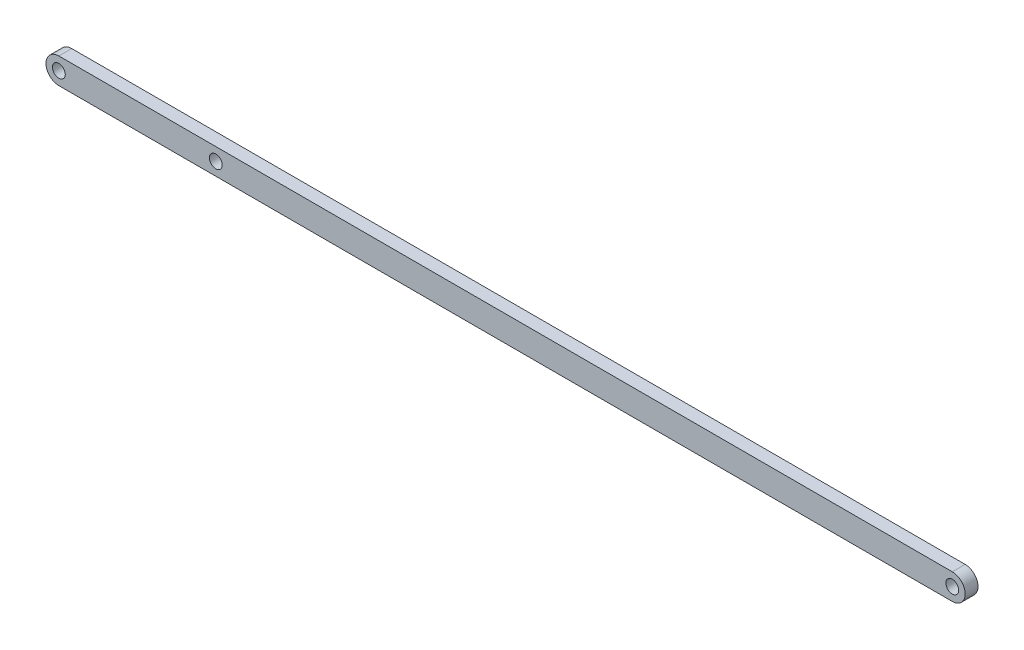
ISO-10303-21;
HEADER;
FILE_DESCRIPTION(('STEP AP214'),'2;1');
FILE_NAME('part.step','',(''),(''),'','','');
FILE_SCHEMA(('AUTOMOTIVE_DESIGN { 1 0 10303 214 1 1 1 1 }'));
ENDSEC;
DATA;
#1=APPLICATION_CONTEXT('core data for automotive mechanical design processes');
#2=APPLICATION_PROTOCOL_DEFINITION('international standard','automotive_design',2000,#1);
#3=PRODUCT_CONTEXT('',#1,'mechanical');
#4=PRODUCT('Part','Part','',(#3));
#5=PRODUCT_RELATED_PRODUCT_CATEGORY('part','',(#4));
#6=PRODUCT_DEFINITION_FORMATION('','',#4);
#7=PRODUCT_DEFINITION_CONTEXT('part definition',#1,'design');
#8=PRODUCT_DEFINITION('design','',#6,#7);
#9=PRODUCT_DEFINITION_SHAPE('','',#8);
#10=(LENGTH_UNIT() NAMED_UNIT(*) SI_UNIT(.MILLI.,.METRE.));
#11=(NAMED_UNIT(*) PLANE_ANGLE_UNIT() SI_UNIT($,.RADIAN.));
#12=(NAMED_UNIT(*) SI_UNIT($,.STERADIAN.) SOLID_ANGLE_UNIT());
#13=UNCERTAINTY_MEASURE_WITH_UNIT(LENGTH_MEASURE(1.E-05),#10,'distance_accuracy_value','');
#14=(GEOMETRIC_REPRESENTATION_CONTEXT(3) GLOBAL_UNCERTAINTY_ASSIGNED_CONTEXT((#13)) GLOBAL_UNIT_ASSIGNED_CONTEXT((#10,
#11,#12)) REPRESENTATION_CONTEXT('',''));
#15=CARTESIAN_POINT('',(0.,0.,0.));
#16=DIRECTION('',(0.,0.,1.));
#17=DIRECTION('',(1.,0.,0.));
#18=AXIS2_PLACEMENT_3D('',#15,#16,#17);
#19=CARTESIAN_POINT('',(-173.74,0.,5.));
#20=DIRECTION('',(0.,0.,1.));
#21=DIRECTION('',(1.,0.,0.));
#22=AXIS2_PLACEMENT_3D('',#19,#20,#21);
#23=PLANE('',#22);
#24=CARTESIAN_POINT('',(173.74,0.,5.));
#25=DIRECTION('',(0.,0.,1.));
#26=DIRECTION('',(1.,0.,0.));
#27=AXIS2_PLACEMENT_3D('',#24,#25,#26);
#28=CIRCLE('',#27,2.5);
#29=CARTESIAN_POINT('',(176.24,0.,5.));
#30=VERTEX_POINT('',#29);
#31=EDGE_CURVE('E138',#30,#30,#28,.T.);
#32=ORIENTED_EDGE('',*,*,#31,.F.);
#33=EDGE_LOOP('',(#32));
#34=FACE_BOUND('',#33,.T.);
#35=CARTESIAN_POINT('',(-173.74,0.,5.));
#36=DIRECTION('',(0.,0.,1.));
#37=DIRECTION('',(1.,0.,0.));
#38=AXIS2_PLACEMENT_3D('',#35,#36,#37);
#39=CIRCLE('',#38,5.00000000000009);
#40=CARTESIAN_POINT('',(-173.74,4.99999999999998,5.));
#41=VERTEX_POINT('',#40);
#42=CARTESIAN_POINT('',(-173.74,-5.00000000000019,5.));
#43=VERTEX_POINT('',#42);
#44=EDGE_CURVE('E96',#41,#43,#39,.T.);
#45=ORIENTED_EDGE('',*,*,#44,.T.);
#46=DIRECTION('',(1.,0.,0.));
#47=VECTOR('',#46,1.);
#48=CARTESIAN_POINT('',(173.74,-5.00000000000009,5.));
#49=LINE('',#48,#47);
#50=CARTESIAN_POINT('',(173.74,-5.,5.));
#51=VERTEX_POINT('',#50);
#52=EDGE_CURVE('E91',#43,#51,#49,.T.);
#53=ORIENTED_EDGE('',*,*,#52,.T.);
#54=CARTESIAN_POINT('',(173.74,0.,5.));
#55=DIRECTION('',(0.,0.,1.));
#56=DIRECTION('',(-1.,0.,0.));
#57=AXIS2_PLACEMENT_3D('',#54,#55,#56);
#58=CIRCLE('',#57,5.00000000000009);
#59=CARTESIAN_POINT('',(173.74,5.00000000000009,5.));
#60=VERTEX_POINT('',#59);
#61=EDGE_CURVE('E94',#51,#60,#58,.T.);
#62=ORIENTED_EDGE('',*,*,#61,.T.);
#63=DIRECTION('',(-1.,0.,0.));
#64=VECTOR('',#63,1.);
#65=CARTESIAN_POINT('',(173.74,5.00000000000009,5.));
#66=LINE('',#65,#64);
#67=EDGE_CURVE('E61',#60,#41,#66,.T.);
#68=ORIENTED_EDGE('',*,*,#67,.T.);
#69=EDGE_LOOP('',(#45,#53,#62,#68));
#70=FACE_BOUND('',#69,.T.);
#71=CARTESIAN_POINT('',(-173.74,0.,5.));
#72=DIRECTION('',(0.,0.,1.));
#73=DIRECTION('',(1.,0.,0.));
#74=AXIS2_PLACEMENT_3D('',#71,#72,#73);
#75=CIRCLE('',#74,2.5);
#76=CARTESIAN_POINT('',(-171.24,0.,5.));
#77=VERTEX_POINT('',#76);
#78=EDGE_CURVE('E116',#77,#77,#75,.T.);
#79=ORIENTED_EDGE('',*,*,#78,.F.);
#80=EDGE_LOOP('',(#79));
#81=FACE_BOUND('',#80,.T.);
#82=CARTESIAN_POINT('',(-112.7,0.,5.));
#83=DIRECTION('',(0.,0.,1.));
#84=DIRECTION('',(1.,0.,0.));
#85=AXIS2_PLACEMENT_3D('',#82,#83,#84);
#86=CIRCLE('',#85,2.49999999999999);
#87=CARTESIAN_POINT('',(-110.2,0.,5.));
#88=VERTEX_POINT('',#87);
#89=EDGE_CURVE('E146',#88,#88,#86,.T.);
#90=ORIENTED_EDGE('',*,*,#89,.F.);
#91=EDGE_LOOP('',(#90));
#92=FACE_BOUND('',#91,.T.);
#93=ADVANCED_FACE('F43',(#34,#70,#81,#92),#23,.T.);
#94=CARTESIAN_POINT('',(-173.74,0.,0.));
#95=DIRECTION('',(0.,0.,1.));
#96=DIRECTION('',(1.,0.,0.));
#97=AXIS2_PLACEMENT_3D('',#94,#95,#96);
#98=PLANE('',#97);
#99=CARTESIAN_POINT('',(-173.74,0.,0.));
#100=DIRECTION('',(0.,0.,1.));
#101=DIRECTION('',(1.,0.,0.));
#102=AXIS2_PLACEMENT_3D('',#99,#100,#101);
#103=CIRCLE('',#102,5.00000000000009);
#104=CARTESIAN_POINT('',(-173.74,4.99999999999998,0.));
#105=VERTEX_POINT('',#104);
#106=CARTESIAN_POINT('',(-173.74,-5.00000000000019,0.));
#107=VERTEX_POINT('',#106);
#108=EDGE_CURVE('E112',#105,#107,#103,.T.);
#109=ORIENTED_EDGE('',*,*,#108,.F.);
#110=DIRECTION('',(-1.,0.,0.));
#111=VECTOR('',#110,1.);
#112=CARTESIAN_POINT('',(173.74,5.00000000000009,0.));
#113=LINE('',#112,#111);
#114=CARTESIAN_POINT('',(173.74,5.00000000000009,0.));
#115=VERTEX_POINT('',#114);
#116=EDGE_CURVE('E84',#115,#105,#113,.T.);
#117=ORIENTED_EDGE('',*,*,#116,.F.);
#118=CARTESIAN_POINT('',(173.74,0.,0.));
#119=DIRECTION('',(0.,0.,1.));
#120=DIRECTION('',(-1.,0.,0.));
#121=AXIS2_PLACEMENT_3D('',#118,#119,#120);
#122=CIRCLE('',#121,5.00000000000009);
#123=CARTESIAN_POINT('',(173.74,-5.,0.));
#124=VERTEX_POINT('',#123);
#125=EDGE_CURVE('E78',#124,#115,#122,.T.);
#126=ORIENTED_EDGE('',*,*,#125,.F.);
#127=DIRECTION('',(1.,0.,0.));
#128=VECTOR('',#127,1.);
#129=CARTESIAN_POINT('',(173.74,-5.00000000000009,0.));
#130=LINE('',#129,#128);
#131=EDGE_CURVE('E101',#107,#124,#130,.T.);
#132=ORIENTED_EDGE('',*,*,#131,.F.);
#133=EDGE_LOOP('',(#109,#117,#126,#132));
#134=FACE_BOUND('',#133,.T.);
#135=CARTESIAN_POINT('',(-173.74,0.,0.));
#136=DIRECTION('',(0.,0.,1.));
#137=DIRECTION('',(1.,0.,0.));
#138=AXIS2_PLACEMENT_3D('',#135,#136,#137);
#139=CIRCLE('',#138,2.5);
#140=CARTESIAN_POINT('',(-171.24,0.,0.));
#141=VERTEX_POINT('',#140);
#142=EDGE_CURVE('E134',#141,#141,#139,.T.);
#143=ORIENTED_EDGE('',*,*,#142,.T.);
#144=EDGE_LOOP('',(#143));
#145=FACE_BOUND('',#144,.T.);
#146=CARTESIAN_POINT('',(173.74,0.,0.));
#147=DIRECTION('',(0.,0.,1.));
#148=DIRECTION('',(1.,0.,0.));
#149=AXIS2_PLACEMENT_3D('',#146,#147,#148);
#150=CIRCLE('',#149,2.5);
#151=CARTESIAN_POINT('',(176.24,0.,0.));
#152=VERTEX_POINT('',#151);
#153=EDGE_CURVE('E142',#152,#152,#150,.T.);
#154=ORIENTED_EDGE('',*,*,#153,.T.);
#155=EDGE_LOOP('',(#154));
#156=FACE_BOUND('',#155,.T.);
#157=CARTESIAN_POINT('',(-112.7,0.,0.));
#158=DIRECTION('',(0.,0.,1.));
#159=DIRECTION('',(1.,0.,0.));
#160=AXIS2_PLACEMENT_3D('',#157,#158,#159);
#161=CIRCLE('',#160,2.49999999999999);
#162=CARTESIAN_POINT('',(-110.2,0.,0.));
#163=VERTEX_POINT('',#162);
#164=EDGE_CURVE('E150',#163,#163,#161,.T.);
#165=ORIENTED_EDGE('',*,*,#164,.T.);
#166=EDGE_LOOP('',(#165));
#167=FACE_BOUND('',#166,.T.);
#168=ADVANCED_FACE('F129',(#134,#145,#156,#167),#98,.F.);
#169=CARTESIAN_POINT('',(-173.74,0.,5.));
#170=DIRECTION('',(0.,0.,-1.));
#171=DIRECTION('',(-1.,0.,0.));
#172=AXIS2_PLACEMENT_3D('',#169,#170,#171);
#173=CYLINDRICAL_SURFACE('',#172,5.00000000000009);
#174=ORIENTED_EDGE('',*,*,#108,.T.);
#175=DIRECTION('',(0.,0.,-1.));
#176=VECTOR('',#175,1.);
#177=CARTESIAN_POINT('',(-173.74,-5.00000000000019,5.));
#178=LINE('',#177,#176);
#179=EDGE_CURVE('E11',#43,#107,#178,.T.);
#180=ORIENTED_EDGE('',*,*,#179,.F.);
#181=ORIENTED_EDGE('',*,*,#44,.F.);
#182=DIRECTION('',(0.,0.,-1.));
#183=VECTOR('',#182,1.);
#184=CARTESIAN_POINT('',(-173.74,4.99999999999998,5.));
#185=LINE('',#184,#183);
#186=EDGE_CURVE('E108',#41,#105,#185,.T.);
#187=ORIENTED_EDGE('',*,*,#186,.T.);
#188=EDGE_LOOP('',(#174,#180,#181,#187));
#189=FACE_BOUND('',#188,.T.);
#190=ADVANCED_FACE('F45',(#189),#173,.T.);
#191=CARTESIAN_POINT('',(173.74,-5.00000000000009,5.));
#192=DIRECTION('',(0.,1.,0.));
#193=DIRECTION('',(-1.,0.,0.));
#194=AXIS2_PLACEMENT_3D('',#191,#192,#193);
#195=PLANE('',#194);
#196=ORIENTED_EDGE('',*,*,#131,.T.);
#197=DIRECTION('',(0.,0.,-1.));
#198=VECTOR('',#197,1.);
#199=CARTESIAN_POINT('',(173.74,-5.,5.));
#200=LINE('',#199,#198);
#201=EDGE_CURVE('E53',#51,#124,#200,.T.);
#202=ORIENTED_EDGE('',*,*,#201,.F.);
#203=ORIENTED_EDGE('',*,*,#52,.F.);
#204=ORIENTED_EDGE('',*,*,#179,.T.);
#205=EDGE_LOOP('',(#196,#202,#203,#204));
#206=FACE_BOUND('',#205,.T.);
#207=ADVANCED_FACE('F100',(#206),#195,.F.);
#208=CARTESIAN_POINT('',(173.74,0.,5.));
#209=DIRECTION('',(0.,0.,-1.));
#210=DIRECTION('',(-1.,0.,0.));
#211=AXIS2_PLACEMENT_3D('',#208,#209,#210);
#212=CYLINDRICAL_SURFACE('',#211,5.00000000000009);
#213=ORIENTED_EDGE('',*,*,#125,.T.);
#214=DIRECTION('',(0.,0.,-1.));
#215=VECTOR('',#214,1.);
#216=CARTESIAN_POINT('',(173.74,5.00000000000009,5.));
#217=LINE('',#216,#215);
#218=EDGE_CURVE('E103',#60,#115,#217,.T.);
#219=ORIENTED_EDGE('',*,*,#218,.F.);
#220=ORIENTED_EDGE('',*,*,#61,.F.);
#221=ORIENTED_EDGE('',*,*,#201,.T.);
#222=EDGE_LOOP('',(#213,#219,#220,#221));
#223=FACE_BOUND('',#222,.T.);
#224=ADVANCED_FACE('F104',(#223),#212,.T.);
#225=CARTESIAN_POINT('',(173.74,5.00000000000009,5.));
#226=DIRECTION('',(0.,-1.,0.));
#227=DIRECTION('',(1.,0.,0.));
#228=AXIS2_PLACEMENT_3D('',#225,#226,#227);
#229=PLANE('',#228);
#230=ORIENTED_EDGE('',*,*,#116,.T.);
#231=ORIENTED_EDGE('',*,*,#186,.F.);
#232=ORIENTED_EDGE('',*,*,#67,.F.);
#233=ORIENTED_EDGE('',*,*,#218,.T.);
#234=EDGE_LOOP('',(#230,#231,#232,#233));
#235=FACE_BOUND('',#234,.T.);
#236=ADVANCED_FACE('F126',(#235),#229,.F.);
#237=CARTESIAN_POINT('',(-173.74,0.,5.));
#238=DIRECTION('',(0.,0.,-1.));
#239=DIRECTION('',(-1.,0.,0.));
#240=AXIS2_PLACEMENT_3D('',#237,#238,#239);
#241=CYLINDRICAL_SURFACE('',#240,2.5);
#242=ORIENTED_EDGE('',*,*,#78,.T.);
#243=EDGE_LOOP('',(#242));
#244=FACE_BOUND('',#243,.T.);
#245=ORIENTED_EDGE('',*,*,#142,.F.);
#246=EDGE_LOOP('',(#245));
#247=FACE_BOUND('',#246,.T.);
#248=ADVANCED_FACE('F170',(#244,#247),#241,.F.);
#249=CARTESIAN_POINT('',(173.74,0.,5.));
#250=DIRECTION('',(0.,0.,-1.));
#251=DIRECTION('',(-1.,0.,0.));
#252=AXIS2_PLACEMENT_3D('',#249,#250,#251);
#253=CYLINDRICAL_SURFACE('',#252,2.5);
#254=ORIENTED_EDGE('',*,*,#31,.T.);
#255=EDGE_LOOP('',(#254));
#256=FACE_BOUND('',#255,.T.);
#257=ORIENTED_EDGE('',*,*,#153,.F.);
#258=EDGE_LOOP('',(#257));
#259=FACE_BOUND('',#258,.T.);
#260=ADVANCED_FACE('F224',(#256,#259),#253,.F.);
#261=CARTESIAN_POINT('',(-112.7,0.,5.));
#262=DIRECTION('',(0.,0.,-1.));
#263=DIRECTION('',(-1.,0.,0.));
#264=AXIS2_PLACEMENT_3D('',#261,#262,#263);
#265=CYLINDRICAL_SURFACE('',#264,2.49999999999999);
#266=ORIENTED_EDGE('',*,*,#89,.T.);
#267=EDGE_LOOP('',(#266));
#268=FACE_BOUND('',#267,.T.);
#269=ORIENTED_EDGE('',*,*,#164,.F.);
#270=EDGE_LOOP('',(#269));
#271=FACE_BOUND('',#270,.T.);
#272=ADVANCED_FACE('F158',(#268,#271),#265,.F.);
#273=CLOSED_SHELL('',(#93,#168,#190,#207,#224,#236,#248,#260,#272));
#274=MANIFOLD_SOLID_BREP('B2',#273);
#275=ADVANCED_BREP_SHAPE_REPRESENTATION('',(#18,#274),#14);
#276=SHAPE_DEFINITION_REPRESENTATION(#9,#275);
ENDSEC;
END-ISO-10303-21;
